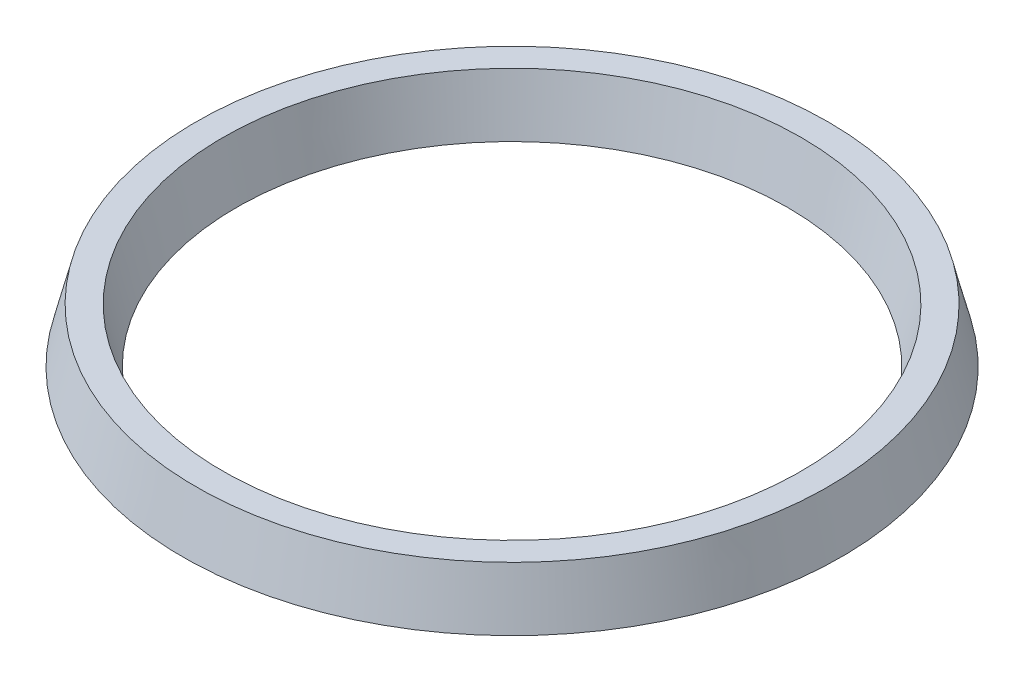
ISO-10303-21;
HEADER;
FILE_DESCRIPTION(('STEP AP214'),'2;1');
FILE_NAME('part.step','',(''),(''),'','','');
FILE_SCHEMA(('AUTOMOTIVE_DESIGN { 1 0 10303 214 1 1 1 1 }'));
ENDSEC;
DATA;
#1=APPLICATION_CONTEXT('core data for automotive mechanical design processes');
#2=APPLICATION_PROTOCOL_DEFINITION('international standard','automotive_design',2000,#1);
#3=PRODUCT_CONTEXT('',#1,'mechanical');
#4=PRODUCT('Part','Part','',(#3));
#5=PRODUCT_RELATED_PRODUCT_CATEGORY('part','',(#4));
#6=PRODUCT_DEFINITION_FORMATION('','',#4);
#7=PRODUCT_DEFINITION_CONTEXT('part definition',#1,'design');
#8=PRODUCT_DEFINITION('design','',#6,#7);
#9=PRODUCT_DEFINITION_SHAPE('','',#8);
#10=(LENGTH_UNIT() NAMED_UNIT(*) SI_UNIT(.MILLI.,.METRE.));
#11=(NAMED_UNIT(*) PLANE_ANGLE_UNIT() SI_UNIT($,.RADIAN.));
#12=(NAMED_UNIT(*) SI_UNIT($,.STERADIAN.) SOLID_ANGLE_UNIT());
#13=UNCERTAINTY_MEASURE_WITH_UNIT(LENGTH_MEASURE(1.E-05),#10,'distance_accuracy_value','');
#14=(GEOMETRIC_REPRESENTATION_CONTEXT(3) GLOBAL_UNCERTAINTY_ASSIGNED_CONTEXT((#13)) GLOBAL_UNIT_ASSIGNED_CONTEXT((#10,
#11,#12)) REPRESENTATION_CONTEXT('',''));
#15=CARTESIAN_POINT('',(0.,0.,0.));
#16=DIRECTION('',(0.,0.,1.));
#17=DIRECTION('',(1.,0.,0.));
#18=AXIS2_PLACEMENT_3D('',#15,#16,#17);
#19=CARTESIAN_POINT('',(-67.31,-6.00000000000001,0.));
#20=DIRECTION('',(0.,-1.,0.));
#21=DIRECTION('',(0.,0.,-1.));
#22=AXIS2_PLACEMENT_3D('',#19,#20,#21);
#23=CONICAL_SURFACE('',#22,73.31,0.244978663126864);
#24=CARTESIAN_POINT('',(-67.31,6.00000000000001,0.));
#25=DIRECTION('',(0.,-1.,0.));
#26=DIRECTION('',(0.,0.,-1.));
#27=AXIS2_PLACEMENT_3D('',#24,#25,#26);
#28=CIRCLE('',#27,70.31);
#29=CARTESIAN_POINT('',(-67.31,6.00000000000001,-70.31));
#30=VERTEX_POINT('',#29);
#31=EDGE_CURVE('E63',#30,#30,#28,.T.);
#32=ORIENTED_EDGE('',*,*,#31,.T.);
#33=EDGE_LOOP('',(#32));
#34=FACE_BOUND('',#33,.T.);
#35=CARTESIAN_POINT('',(-67.31,-6.00000000000001,0.));
#36=DIRECTION('',(0.,-1.,0.));
#37=DIRECTION('',(0.,0.,-1.));
#38=AXIS2_PLACEMENT_3D('',#35,#36,#37);
#39=CIRCLE('',#38,73.31);
#40=CARTESIAN_POINT('',(-67.31,-6.00000000000001,-73.31));
#41=VERTEX_POINT('',#40);
#42=EDGE_CURVE('E10',#41,#41,#39,.T.);
#43=ORIENTED_EDGE('',*,*,#42,.F.);
#44=EDGE_LOOP('',(#43));
#45=FACE_BOUND('',#44,.T.);
#46=ADVANCED_FACE('F35',(#34,#45),#23,.T.);
#47=CARTESIAN_POINT('',(3.00000000000001,-6.,0.));
#48=DIRECTION('',(0.,-1.,0.));
#49=DIRECTION('',(0.,0.,-1.));
#50=AXIS2_PLACEMENT_3D('',#47,#48,#49);
#51=PLANE('',#50);
#52=ORIENTED_EDGE('',*,*,#42,.T.);
#53=EDGE_LOOP('',(#52));
#54=FACE_BOUND('',#53,.T.);
#55=CARTESIAN_POINT('',(-67.31,-6.,0.));
#56=DIRECTION('',(0.,-1.,0.));
#57=DIRECTION('',(0.,0.,-1.));
#58=AXIS2_PLACEMENT_3D('',#55,#56,#57);
#59=CIRCLE('',#58,70.31);
#60=CARTESIAN_POINT('',(-67.31,-6.,-70.31));
#61=VERTEX_POINT('',#60);
#62=EDGE_CURVE('E41',#61,#61,#59,.T.);
#63=ORIENTED_EDGE('',*,*,#62,.F.);
#64=EDGE_LOOP('',(#63));
#65=FACE_BOUND('',#64,.T.);
#66=ADVANCED_FACE('F81',(#54,#65),#51,.T.);
#67=CARTESIAN_POINT('',(-67.31,-1.455213750218,0.));
#68=DIRECTION('',(0.,-1.,0.));
#69=DIRECTION('',(0.,0.,-1.));
#70=AXIS2_PLACEMENT_3D('',#67,#68,#69);
#71=CONICAL_SURFACE('',#70,69.1738034375545,0.244978663126864);
#72=ORIENTED_EDGE('',*,*,#62,.T.);
#73=EDGE_LOOP('',(#72));
#74=FACE_BOUND('',#73,.T.);
#75=CARTESIAN_POINT('',(-67.31,-1.455213750218,0.));
#76=DIRECTION('',(0.,-1.,0.));
#77=DIRECTION('',(0.,0.,-1.));
#78=AXIS2_PLACEMENT_3D('',#75,#76,#77);
#79=CIRCLE('',#78,69.1738034375545);
#80=CARTESIAN_POINT('',(-67.31,-1.455213750218,-69.1738034375545));
#81=VERTEX_POINT('',#80);
#82=EDGE_CURVE('E45',#81,#81,#79,.T.);
#83=ORIENTED_EDGE('',*,*,#82,.F.);
#84=EDGE_LOOP('',(#83));
#85=FACE_BOUND('',#84,.T.);
#86=ADVANCED_FACE('F85',(#74,#85),#71,.F.);
#87=CARTESIAN_POINT('',(-67.31,-1.92116460960662,0.));
#88=DIRECTION('',(0.,-1.,0.));
#89=DIRECTION('',(0.,0.,-1.));
#90=AXIS2_PLACEMENT_3D('',#87,#88,#89);
#91=TOROIDAL_SURFACE('',#90,67.31,1.92116460960662);
#92=ORIENTED_EDGE('',*,*,#82,.T.);
#93=EDGE_LOOP('',(#92));
#94=FACE_BOUND('',#93,.T.);
#95=CARTESIAN_POINT('',(-67.31,-1.455213750218,0.));
#96=DIRECTION('',(0.,-1.,0.));
#97=DIRECTION('',(0.,0.,-1.));
#98=AXIS2_PLACEMENT_3D('',#95,#96,#97);
#99=CIRCLE('',#98,65.4461965624455);
#100=CARTESIAN_POINT('',(-67.31,-1.455213750218,-65.4461965624455));
#101=VERTEX_POINT('',#100);
#102=EDGE_CURVE('E49',#101,#101,#99,.T.);
#103=ORIENTED_EDGE('',*,*,#102,.F.);
#104=EDGE_LOOP('',(#103));
#105=FACE_BOUND('',#104,.T.);
#106=ADVANCED_FACE('F89',(#94,#105),#91,.F.);
#107=CARTESIAN_POINT('',(-67.31,-6.,0.));
#108=DIRECTION('',(0.,1.,0.));
#109=DIRECTION('',(0.,0.,1.));
#110=AXIS2_PLACEMENT_3D('',#107,#108,#109);
#111=CONICAL_SURFACE('',#110,64.31,0.244978663126864);
#112=ORIENTED_EDGE('',*,*,#102,.T.);
#113=EDGE_LOOP('',(#112));
#114=FACE_BOUND('',#113,.T.);
#115=CARTESIAN_POINT('',(-67.31,-6.,0.));
#116=DIRECTION('',(0.,-1.,0.));
#117=DIRECTION('',(0.,0.,-1.));
#118=AXIS2_PLACEMENT_3D('',#115,#116,#117);
#119=CIRCLE('',#118,64.31);
#120=CARTESIAN_POINT('',(-67.31,-6.,-64.31));
#121=VERTEX_POINT('',#120);
#122=EDGE_CURVE('E54',#121,#121,#119,.T.);
#123=ORIENTED_EDGE('',*,*,#122,.F.);
#124=EDGE_LOOP('',(#123));
#125=FACE_BOUND('',#124,.T.);
#126=ADVANCED_FACE('F95',(#114,#125),#111,.T.);
#127=CARTESIAN_POINT('',(-5.99999999999999,-6.,0.));
#128=DIRECTION('',(0.,-1.,0.));
#129=DIRECTION('',(0.,0.,-1.));
#130=AXIS2_PLACEMENT_3D('',#127,#128,#129);
#131=PLANE('',#130);
#132=ORIENTED_EDGE('',*,*,#122,.T.);
#133=EDGE_LOOP('',(#132));
#134=FACE_BOUND('',#133,.T.);
#135=CARTESIAN_POINT('',(-67.31,-6.,0.));
#136=DIRECTION('',(0.,-1.,0.));
#137=DIRECTION('',(0.,0.,-1.));
#138=AXIS2_PLACEMENT_3D('',#135,#136,#137);
#139=CIRCLE('',#138,61.31);
#140=CARTESIAN_POINT('',(-67.31,-6.,-61.31));
#141=VERTEX_POINT('',#140);
#142=EDGE_CURVE('E57',#141,#141,#139,.T.);
#143=ORIENTED_EDGE('',*,*,#142,.F.);
#144=EDGE_LOOP('',(#143));
#145=FACE_BOUND('',#144,.T.);
#146=ADVANCED_FACE('F77',(#134,#145),#131,.T.);
#147=CARTESIAN_POINT('',(-67.31,6.,0.));
#148=DIRECTION('',(0.,1.,0.));
#149=DIRECTION('',(0.,0.,1.));
#150=AXIS2_PLACEMENT_3D('',#147,#148,#149);
#151=CONICAL_SURFACE('',#150,64.31,0.244978663126864);
#152=ORIENTED_EDGE('',*,*,#142,.T.);
#153=EDGE_LOOP('',(#152));
#154=FACE_BOUND('',#153,.T.);
#155=CARTESIAN_POINT('',(-67.31,6.,0.));
#156=DIRECTION('',(0.,-1.,0.));
#157=DIRECTION('',(0.,0.,-1.));
#158=AXIS2_PLACEMENT_3D('',#155,#156,#157);
#159=CIRCLE('',#158,64.31);
#160=CARTESIAN_POINT('',(-67.31,6.,-64.31));
#161=VERTEX_POINT('',#160);
#162=EDGE_CURVE('E60',#161,#161,#159,.T.);
#163=ORIENTED_EDGE('',*,*,#162,.F.);
#164=EDGE_LOOP('',(#163));
#165=FACE_BOUND('',#164,.T.);
#166=ADVANCED_FACE('F71',(#154,#165),#151,.F.);
#167=CARTESIAN_POINT('',(3.00000000000001,6.,0.));
#168=DIRECTION('',(0.,1.,0.));
#169=DIRECTION('',(0.,0.,1.));
#170=AXIS2_PLACEMENT_3D('',#167,#168,#169);
#171=PLANE('',#170);
#172=ORIENTED_EDGE('',*,*,#162,.T.);
#173=EDGE_LOOP('',(#172));
#174=FACE_BOUND('',#173,.T.);
#175=ORIENTED_EDGE('',*,*,#31,.F.);
#176=EDGE_LOOP('',(#175));
#177=FACE_BOUND('',#176,.T.);
#178=ADVANCED_FACE('F69',(#174,#177),#171,.T.);
#179=CLOSED_SHELL('',(#46,#66,#86,#106,#126,#146,#166,#178));
#180=MANIFOLD_SOLID_BREP('B2',#179);
#181=ADVANCED_BREP_SHAPE_REPRESENTATION('',(#18,#180),#14);
#182=SHAPE_DEFINITION_REPRESENTATION(#9,#181);
ENDSEC;
END-ISO-10303-21;
